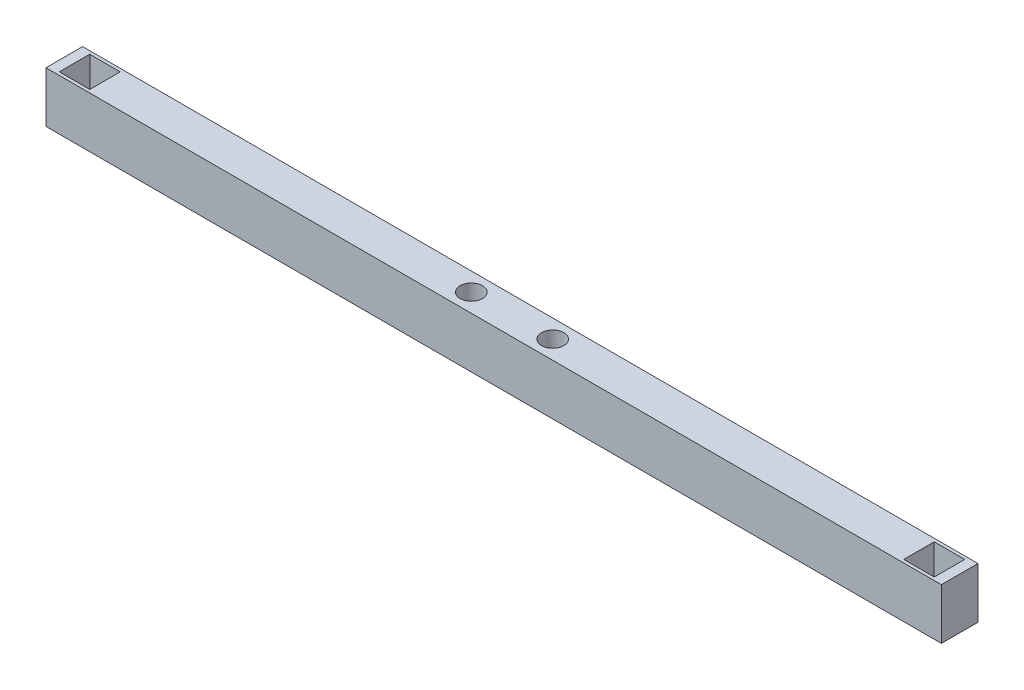
ISO-10303-21;
HEADER;
FILE_DESCRIPTION(('STEP AP214'),'2;1');
FILE_NAME('part.step','',(''),(''),'','','');
FILE_SCHEMA(('AUTOMOTIVE_DESIGN { 1 0 10303 214 1 1 1 1 }'));
ENDSEC;
DATA;
#1=APPLICATION_CONTEXT('core data for automotive mechanical design processes');
#2=APPLICATION_PROTOCOL_DEFINITION('international standard','automotive_design',2000,#1);
#3=PRODUCT_CONTEXT('',#1,'mechanical');
#4=PRODUCT('Part','Part','',(#3));
#5=PRODUCT_RELATED_PRODUCT_CATEGORY('part','',(#4));
#6=PRODUCT_DEFINITION_FORMATION('','',#4);
#7=PRODUCT_DEFINITION_CONTEXT('part definition',#1,'design');
#8=PRODUCT_DEFINITION('design','',#6,#7);
#9=PRODUCT_DEFINITION_SHAPE('','',#8);
#10=(LENGTH_UNIT() NAMED_UNIT(*) SI_UNIT(.MILLI.,.METRE.));
#11=(NAMED_UNIT(*) PLANE_ANGLE_UNIT() SI_UNIT($,.RADIAN.));
#12=(NAMED_UNIT(*) SI_UNIT($,.STERADIAN.) SOLID_ANGLE_UNIT());
#13=UNCERTAINTY_MEASURE_WITH_UNIT(LENGTH_MEASURE(1.E-05),#10,'distance_accuracy_value','');
#14=(GEOMETRIC_REPRESENTATION_CONTEXT(3) GLOBAL_UNCERTAINTY_ASSIGNED_CONTEXT((#13)) GLOBAL_UNIT_ASSIGNED_CONTEXT((#10,
#11,#12)) REPRESENTATION_CONTEXT('',''));
#15=CARTESIAN_POINT('',(0.,0.,0.));
#16=DIRECTION('',(0.,0.,1.));
#17=DIRECTION('',(1.,0.,0.));
#18=AXIS2_PLACEMENT_3D('',#15,#16,#17);
#19=CARTESIAN_POINT('',(0.,50.,0.));
#20=DIRECTION('',(0.,1.,0.));
#21=DIRECTION('',(0.,0.,1.));
#22=AXIS2_PLACEMENT_3D('',#19,#20,#21);
#23=PLANE('',#22);
#24=CARTESIAN_POINT('',(-40.,50.,0.));
#25=DIRECTION('',(0.,1.,0.));
#26=DIRECTION('',(0.,0.,1.));
#27=AXIS2_PLACEMENT_3D('',#24,#25,#26);
#28=CIRCLE('',#27,11.);
#29=CARTESIAN_POINT('',(-40.,50.,11.));
#30=VERTEX_POINT('',#29);
#31=EDGE_CURVE('E364',#30,#30,#28,.T.);
#32=ORIENTED_EDGE('',*,*,#31,.F.);
#33=EDGE_LOOP('',(#32));
#34=FACE_BOUND('',#33,.T.);
#35=CARTESIAN_POINT('',(40.,50.,0.));
#36=DIRECTION('',(0.,1.,0.));
#37=DIRECTION('',(0.,0.,1.));
#38=AXIS2_PLACEMENT_3D('',#35,#36,#37);
#39=CIRCLE('',#38,11.);
#40=CARTESIAN_POINT('',(40.,50.,11.));
#41=VERTEX_POINT('',#40);
#42=EDGE_CURVE('E160',#41,#41,#39,.T.);
#43=ORIENTED_EDGE('',*,*,#42,.F.);
#44=EDGE_LOOP('',(#43));
#45=FACE_BOUND('',#44,.T.);
#46=DIRECTION('',(1.,0.,0.));
#47=VECTOR('',#46,1.);
#48=CARTESIAN_POINT('',(400.,50.,15.));
#49=LINE('',#48,#47);
#50=CARTESIAN_POINT('',(400.,50.,15.));
#51=VERTEX_POINT('',#50);
#52=CARTESIAN_POINT('',(430.,50.,15.));
#53=VERTEX_POINT('',#52);
#54=EDGE_CURVE('E54',#51,#53,#49,.T.);
#55=ORIENTED_EDGE('',*,*,#54,.F.);
#56=DIRECTION('',(0.,0.,1.));
#57=VECTOR('',#56,1.);
#58=CARTESIAN_POINT('',(400.,50.,-15.));
#59=LINE('',#58,#57);
#60=CARTESIAN_POINT('',(400.,50.,-15.));
#61=VERTEX_POINT('',#60);
#62=EDGE_CURVE('E153',#61,#51,#59,.T.);
#63=ORIENTED_EDGE('',*,*,#62,.F.);
#64=DIRECTION('',(1.,0.,0.));
#65=VECTOR('',#64,1.);
#66=CARTESIAN_POINT('',(400.,50.,-15.));
#67=LINE('',#66,#65);
#68=CARTESIAN_POINT('',(430.,50.,-15.));
#69=VERTEX_POINT('',#68);
#70=EDGE_CURVE('E157',#61,#69,#67,.T.);
#71=ORIENTED_EDGE('',*,*,#70,.T.);
#72=DIRECTION('',(0.,0.,1.));
#73=VECTOR('',#72,1.);
#74=CARTESIAN_POINT('',(430.,50.,-15.));
#75=LINE('',#74,#73);
#76=EDGE_CURVE('E169',#69,#53,#75,.T.);
#77=ORIENTED_EDGE('',*,*,#76,.T.);
#78=EDGE_LOOP('',(#55,#63,#71,#77));
#79=FACE_BOUND('',#78,.T.);
#80=DIRECTION('',(0.,0.,-1.));
#81=VECTOR('',#80,1.);
#82=CARTESIAN_POINT('',(440.,50.,-18.));
#83=LINE('',#82,#81);
#84=CARTESIAN_POINT('',(440.,50.,18.));
#85=VERTEX_POINT('',#84);
#86=CARTESIAN_POINT('',(440.,50.,-18.));
#87=VERTEX_POINT('',#86);
#88=EDGE_CURVE('E225',#85,#87,#83,.T.);
#89=ORIENTED_EDGE('',*,*,#88,.T.);
#90=DIRECTION('',(-1.,0.,0.));
#91=VECTOR('',#90,1.);
#92=CARTESIAN_POINT('',(-440.,50.,-18.));
#93=LINE('',#92,#91);
#94=CARTESIAN_POINT('',(-440.,50.,-18.));
#95=VERTEX_POINT('',#94);
#96=EDGE_CURVE('E229',#87,#95,#93,.T.);
#97=ORIENTED_EDGE('',*,*,#96,.T.);
#98=DIRECTION('',(0.,0.,1.));
#99=VECTOR('',#98,1.);
#100=CARTESIAN_POINT('',(-440.,50.,-18.));
#101=LINE('',#100,#99);
#102=CARTESIAN_POINT('',(-440.,50.,18.));
#103=VERTEX_POINT('',#102);
#104=EDGE_CURVE('E233',#95,#103,#101,.T.);
#105=ORIENTED_EDGE('',*,*,#104,.T.);
#106=DIRECTION('',(1.,0.,0.));
#107=VECTOR('',#106,1.);
#108=CARTESIAN_POINT('',(-440.,50.,18.));
#109=LINE('',#108,#107);
#110=EDGE_CURVE('E236',#103,#85,#109,.T.);
#111=ORIENTED_EDGE('',*,*,#110,.T.);
#112=EDGE_LOOP('',(#89,#97,#105,#111));
#113=FACE_BOUND('',#112,.T.);
#114=DIRECTION('',(0.,0.,1.));
#115=VECTOR('',#114,1.);
#116=CARTESIAN_POINT('',(-400.,50.,-15.));
#117=LINE('',#116,#115);
#118=CARTESIAN_POINT('',(-400.,50.,-15.));
#119=VERTEX_POINT('',#118);
#120=CARTESIAN_POINT('',(-400.,50.,15.));
#121=VERTEX_POINT('',#120);
#122=EDGE_CURVE('E198',#119,#121,#117,.T.);
#123=ORIENTED_EDGE('',*,*,#122,.T.);
#124=DIRECTION('',(-1.,0.,0.));
#125=VECTOR('',#124,1.);
#126=CARTESIAN_POINT('',(-400.,50.,15.));
#127=LINE('',#126,#125);
#128=CARTESIAN_POINT('',(-430.,50.,15.));
#129=VERTEX_POINT('',#128);
#130=EDGE_CURVE('E62',#121,#129,#127,.T.);
#131=ORIENTED_EDGE('',*,*,#130,.T.);
#132=DIRECTION('',(0.,0.,1.));
#133=VECTOR('',#132,1.);
#134=CARTESIAN_POINT('',(-430.,50.,-15.));
#135=LINE('',#134,#133);
#136=CARTESIAN_POINT('',(-430.,50.,-15.));
#137=VERTEX_POINT('',#136);
#138=EDGE_CURVE('E207',#137,#129,#135,.T.);
#139=ORIENTED_EDGE('',*,*,#138,.F.);
#140=DIRECTION('',(-1.,0.,0.));
#141=VECTOR('',#140,1.);
#142=CARTESIAN_POINT('',(-400.,50.,-15.));
#143=LINE('',#142,#141);
#144=EDGE_CURVE('E202',#119,#137,#143,.T.);
#145=ORIENTED_EDGE('',*,*,#144,.F.);
#146=EDGE_LOOP('',(#123,#131,#139,#145));
#147=FACE_BOUND('',#146,.T.);
#148=ADVANCED_FACE('F38',(#34,#45,#79,#113,#147),#23,.T.);
#149=CARTESIAN_POINT('',(0.,0.,0.));
#150=DIRECTION('',(0.,1.,0.));
#151=DIRECTION('',(0.,0.,1.));
#152=AXIS2_PLACEMENT_3D('',#149,#150,#151);
#153=PLANE('',#152);
#154=CARTESIAN_POINT('',(-40.,0.,0.));
#155=DIRECTION('',(0.,1.,0.));
#156=DIRECTION('',(0.,0.,1.));
#157=AXIS2_PLACEMENT_3D('',#154,#155,#156);
#158=CIRCLE('',#157,11.);
#159=CARTESIAN_POINT('',(-40.,0.,11.));
#160=VERTEX_POINT('',#159);
#161=EDGE_CURVE('E188',#160,#160,#158,.T.);
#162=ORIENTED_EDGE('',*,*,#161,.T.);
#163=EDGE_LOOP('',(#162));
#164=FACE_BOUND('',#163,.T.);
#165=CARTESIAN_POINT('',(40.,0.,0.));
#166=DIRECTION('',(0.,1.,0.));
#167=DIRECTION('',(0.,0.,1.));
#168=AXIS2_PLACEMENT_3D('',#165,#166,#167);
#169=CIRCLE('',#168,11.);
#170=CARTESIAN_POINT('',(40.,0.,11.));
#171=VERTEX_POINT('',#170);
#172=EDGE_CURVE('E359',#171,#171,#169,.T.);
#173=ORIENTED_EDGE('',*,*,#172,.T.);
#174=EDGE_LOOP('',(#173));
#175=FACE_BOUND('',#174,.T.);
#176=DIRECTION('',(0.,0.,1.));
#177=VECTOR('',#176,1.);
#178=CARTESIAN_POINT('',(400.,0.,-15.));
#179=LINE('',#178,#177);
#180=CARTESIAN_POINT('',(400.,0.,-15.));
#181=VERTEX_POINT('',#180);
#182=CARTESIAN_POINT('',(400.,0.,15.));
#183=VERTEX_POINT('',#182);
#184=EDGE_CURVE('E147',#181,#183,#179,.T.);
#185=ORIENTED_EDGE('',*,*,#184,.T.);
#186=DIRECTION('',(1.,0.,0.));
#187=VECTOR('',#186,1.);
#188=CARTESIAN_POINT('',(400.,0.,15.));
#189=LINE('',#188,#187);
#190=CARTESIAN_POINT('',(430.,0.,15.));
#191=VERTEX_POINT('',#190);
#192=EDGE_CURVE('E141',#183,#191,#189,.T.);
#193=ORIENTED_EDGE('',*,*,#192,.T.);
#194=DIRECTION('',(0.,0.,1.));
#195=VECTOR('',#194,1.);
#196=CARTESIAN_POINT('',(430.,0.,-15.));
#197=LINE('',#196,#195);
#198=CARTESIAN_POINT('',(430.,0.,-15.));
#199=VERTEX_POINT('',#198);
#200=EDGE_CURVE('E129',#199,#191,#197,.T.);
#201=ORIENTED_EDGE('',*,*,#200,.F.);
#202=DIRECTION('',(1.,0.,0.));
#203=VECTOR('',#202,1.);
#204=CARTESIAN_POINT('',(400.,0.,-15.));
#205=LINE('',#204,#203);
#206=EDGE_CURVE('E140',#181,#199,#205,.T.);
#207=ORIENTED_EDGE('',*,*,#206,.F.);
#208=EDGE_LOOP('',(#185,#193,#201,#207));
#209=FACE_BOUND('',#208,.T.);
#210=DIRECTION('',(0.,0.,-1.));
#211=VECTOR('',#210,1.);
#212=CARTESIAN_POINT('',(440.,0.,-18.));
#213=LINE('',#212,#211);
#214=CARTESIAN_POINT('',(440.,0.,18.));
#215=VERTEX_POINT('',#214);
#216=CARTESIAN_POINT('',(440.,0.,-18.));
#217=VERTEX_POINT('',#216);
#218=EDGE_CURVE('E178',#215,#217,#213,.T.);
#219=ORIENTED_EDGE('',*,*,#218,.F.);
#220=DIRECTION('',(1.,0.,0.));
#221=VECTOR('',#220,1.);
#222=CARTESIAN_POINT('',(-440.,0.,18.));
#223=LINE('',#222,#221);
#224=CARTESIAN_POINT('',(-440.,0.,18.));
#225=VERTEX_POINT('',#224);
#226=EDGE_CURVE('E230',#225,#215,#223,.T.);
#227=ORIENTED_EDGE('',*,*,#226,.F.);
#228=DIRECTION('',(0.,0.,1.));
#229=VECTOR('',#228,1.);
#230=CARTESIAN_POINT('',(-440.,0.,-18.));
#231=LINE('',#230,#229);
#232=CARTESIAN_POINT('',(-440.,0.,-18.));
#233=VERTEX_POINT('',#232);
#234=EDGE_CURVE('E246',#233,#225,#231,.T.);
#235=ORIENTED_EDGE('',*,*,#234,.F.);
#236=DIRECTION('',(-1.,0.,0.));
#237=VECTOR('',#236,1.);
#238=CARTESIAN_POINT('',(-440.,0.,-18.));
#239=LINE('',#238,#237);
#240=EDGE_CURVE('E243',#217,#233,#239,.T.);
#241=ORIENTED_EDGE('',*,*,#240,.F.);
#242=EDGE_LOOP('',(#219,#227,#235,#241));
#243=FACE_BOUND('',#242,.T.);
#244=DIRECTION('',(-1.,0.,0.));
#245=VECTOR('',#244,1.);
#246=CARTESIAN_POINT('',(-400.,0.,15.));
#247=LINE('',#246,#245);
#248=CARTESIAN_POINT('',(-400.,0.,15.));
#249=VERTEX_POINT('',#248);
#250=CARTESIAN_POINT('',(-430.,0.,15.));
#251=VERTEX_POINT('',#250);
#252=EDGE_CURVE('E203',#249,#251,#247,.T.);
#253=ORIENTED_EDGE('',*,*,#252,.F.);
#254=DIRECTION('',(0.,0.,1.));
#255=VECTOR('',#254,1.);
#256=CARTESIAN_POINT('',(-400.,0.,-15.));
#257=LINE('',#256,#255);
#258=CARTESIAN_POINT('',(-400.,0.,-15.));
#259=VERTEX_POINT('',#258);
#260=EDGE_CURVE('E197',#259,#249,#257,.T.);
#261=ORIENTED_EDGE('',*,*,#260,.F.);
#262=DIRECTION('',(-1.,0.,0.));
#263=VECTOR('',#262,1.);
#264=CARTESIAN_POINT('',(-400.,0.,-15.));
#265=LINE('',#264,#263);
#266=CARTESIAN_POINT('',(-430.,0.,-15.));
#267=VERTEX_POINT('',#266);
#268=EDGE_CURVE('E215',#259,#267,#265,.T.);
#269=ORIENTED_EDGE('',*,*,#268,.T.);
#270=DIRECTION('',(0.,0.,1.));
#271=VECTOR('',#270,1.);
#272=CARTESIAN_POINT('',(-430.,0.,-15.));
#273=LINE('',#272,#271);
#274=EDGE_CURVE('E219',#267,#251,#273,.T.);
#275=ORIENTED_EDGE('',*,*,#274,.T.);
#276=EDGE_LOOP('',(#253,#261,#269,#275));
#277=FACE_BOUND('',#276,.T.);
#278=ADVANCED_FACE('F149',(#164,#175,#209,#243,#277),#153,.F.);
#279=CARTESIAN_POINT('',(440.,50.,-18.));
#280=DIRECTION('',(-1.,0.,0.));
#281=DIRECTION('',(0.,0.,1.));
#282=AXIS2_PLACEMENT_3D('',#279,#280,#281);
#283=PLANE('',#282);
#284=ORIENTED_EDGE('',*,*,#218,.T.);
#285=DIRECTION('',(0.,-1.,0.));
#286=VECTOR('',#285,1.);
#287=CARTESIAN_POINT('',(440.,50.,-18.));
#288=LINE('',#287,#286);
#289=EDGE_CURVE('E11',#87,#217,#288,.T.);
#290=ORIENTED_EDGE('',*,*,#289,.F.);
#291=ORIENTED_EDGE('',*,*,#88,.F.);
#292=DIRECTION('',(0.,-1.,0.));
#293=VECTOR('',#292,1.);
#294=CARTESIAN_POINT('',(440.,50.,18.));
#295=LINE('',#294,#293);
#296=EDGE_CURVE('E239',#85,#215,#295,.T.);
#297=ORIENTED_EDGE('',*,*,#296,.T.);
#298=EDGE_LOOP('',(#284,#290,#291,#297));
#299=FACE_BOUND('',#298,.T.);
#300=ADVANCED_FACE('F40',(#299),#283,.F.);
#301=CARTESIAN_POINT('',(-440.,50.,-18.));
#302=DIRECTION('',(0.,0.,1.));
#303=DIRECTION('',(1.,0.,0.));
#304=AXIS2_PLACEMENT_3D('',#301,#302,#303);
#305=PLANE('',#304);
#306=ORIENTED_EDGE('',*,*,#240,.T.);
#307=DIRECTION('',(0.,-1.,0.));
#308=VECTOR('',#307,1.);
#309=CARTESIAN_POINT('',(-440.,50.,-18.));
#310=LINE('',#309,#308);
#311=EDGE_CURVE('E47',#95,#233,#310,.T.);
#312=ORIENTED_EDGE('',*,*,#311,.F.);
#313=ORIENTED_EDGE('',*,*,#96,.F.);
#314=ORIENTED_EDGE('',*,*,#289,.T.);
#315=EDGE_LOOP('',(#306,#312,#313,#314));
#316=FACE_BOUND('',#315,.T.);
#317=ADVANCED_FACE('F278',(#316),#305,.F.);
#318=CARTESIAN_POINT('',(-440.,50.,-18.));
#319=DIRECTION('',(1.,0.,0.));
#320=DIRECTION('',(0.,0.,-1.));
#321=AXIS2_PLACEMENT_3D('',#318,#319,#320);
#322=PLANE('',#321);
#323=ORIENTED_EDGE('',*,*,#234,.T.);
#324=DIRECTION('',(0.,-1.,0.));
#325=VECTOR('',#324,1.);
#326=CARTESIAN_POINT('',(-440.,50.,18.));
#327=LINE('',#326,#325);
#328=EDGE_CURVE('E254',#103,#225,#327,.T.);
#329=ORIENTED_EDGE('',*,*,#328,.F.);
#330=ORIENTED_EDGE('',*,*,#104,.F.);
#331=ORIENTED_EDGE('',*,*,#311,.T.);
#332=EDGE_LOOP('',(#323,#329,#330,#331));
#333=FACE_BOUND('',#332,.T.);
#334=ADVANCED_FACE('F263',(#333),#322,.F.);
#335=CARTESIAN_POINT('',(-440.,50.,18.));
#336=DIRECTION('',(0.,0.,-1.));
#337=DIRECTION('',(-1.,0.,0.));
#338=AXIS2_PLACEMENT_3D('',#335,#336,#337);
#339=PLANE('',#338);
#340=ORIENTED_EDGE('',*,*,#226,.T.);
#341=ORIENTED_EDGE('',*,*,#296,.F.);
#342=ORIENTED_EDGE('',*,*,#110,.F.);
#343=ORIENTED_EDGE('',*,*,#328,.T.);
#344=EDGE_LOOP('',(#340,#341,#342,#343));
#345=FACE_BOUND('',#344,.T.);
#346=ADVANCED_FACE('F271',(#345),#339,.F.);
#347=CARTESIAN_POINT('',(-400.,0.,15.));
#348=DIRECTION('',(0.,0.,-1.));
#349=DIRECTION('',(-1.,0.,0.));
#350=AXIS2_PLACEMENT_3D('',#347,#348,#349);
#351=PLANE('',#350);
#352=ORIENTED_EDGE('',*,*,#130,.F.);
#353=DIRECTION('',(0.,1.,0.));
#354=VECTOR('',#353,1.);
#355=CARTESIAN_POINT('',(-400.,0.,15.));
#356=LINE('',#355,#354);
#357=EDGE_CURVE('E194',#249,#121,#356,.T.);
#358=ORIENTED_EDGE('',*,*,#357,.F.);
#359=ORIENTED_EDGE('',*,*,#252,.T.);
#360=DIRECTION('',(0.,1.,0.));
#361=VECTOR('',#360,1.);
#362=CARTESIAN_POINT('',(-430.,0.,15.));
#363=LINE('',#362,#361);
#364=EDGE_CURVE('E184',#251,#129,#363,.T.);
#365=ORIENTED_EDGE('',*,*,#364,.T.);
#366=EDGE_LOOP('',(#352,#358,#359,#365));
#367=FACE_BOUND('',#366,.T.);
#368=ADVANCED_FACE('F301',(#367),#351,.T.);
#369=CARTESIAN_POINT('',(-430.,0.,-15.));
#370=DIRECTION('',(-1.,0.,0.));
#371=DIRECTION('',(0.,0.,1.));
#372=AXIS2_PLACEMENT_3D('',#369,#370,#371);
#373=PLANE('',#372);
#374=ORIENTED_EDGE('',*,*,#138,.T.);
#375=ORIENTED_EDGE('',*,*,#364,.F.);
#376=ORIENTED_EDGE('',*,*,#274,.F.);
#377=DIRECTION('',(0.,1.,0.));
#378=VECTOR('',#377,1.);
#379=CARTESIAN_POINT('',(-430.,0.,-15.));
#380=LINE('',#379,#378);
#381=EDGE_CURVE('E187',#267,#137,#380,.T.);
#382=ORIENTED_EDGE('',*,*,#381,.T.);
#383=EDGE_LOOP('',(#374,#375,#376,#382));
#384=FACE_BOUND('',#383,.T.);
#385=ADVANCED_FACE('F305',(#384),#373,.F.);
#386=CARTESIAN_POINT('',(-400.,0.,-15.));
#387=DIRECTION('',(0.,0.,-1.));
#388=DIRECTION('',(-1.,0.,0.));
#389=AXIS2_PLACEMENT_3D('',#386,#387,#388);
#390=PLANE('',#389);
#391=ORIENTED_EDGE('',*,*,#144,.T.);
#392=ORIENTED_EDGE('',*,*,#381,.F.);
#393=ORIENTED_EDGE('',*,*,#268,.F.);
#394=DIRECTION('',(0.,1.,0.));
#395=VECTOR('',#394,1.);
#396=CARTESIAN_POINT('',(-400.,0.,-15.));
#397=LINE('',#396,#395);
#398=EDGE_CURVE('E191',#259,#119,#397,.T.);
#399=ORIENTED_EDGE('',*,*,#398,.T.);
#400=EDGE_LOOP('',(#391,#392,#393,#399));
#401=FACE_BOUND('',#400,.T.);
#402=ADVANCED_FACE('F310',(#401),#390,.F.);
#403=CARTESIAN_POINT('',(-400.,0.,-15.));
#404=DIRECTION('',(-1.,0.,0.));
#405=DIRECTION('',(0.,0.,1.));
#406=AXIS2_PLACEMENT_3D('',#403,#404,#405);
#407=PLANE('',#406);
#408=ORIENTED_EDGE('',*,*,#122,.F.);
#409=ORIENTED_EDGE('',*,*,#398,.F.);
#410=ORIENTED_EDGE('',*,*,#260,.T.);
#411=ORIENTED_EDGE('',*,*,#357,.T.);
#412=EDGE_LOOP('',(#408,#409,#410,#411));
#413=FACE_BOUND('',#412,.T.);
#414=ADVANCED_FACE('F297',(#413),#407,.T.);
#415=CARTESIAN_POINT('',(400.,0.,15.));
#416=DIRECTION('',(0.,0.,1.));
#417=DIRECTION('',(1.,0.,0.));
#418=AXIS2_PLACEMENT_3D('',#415,#416,#417);
#419=PLANE('',#418);
#420=ORIENTED_EDGE('',*,*,#54,.T.);
#421=DIRECTION('',(0.,1.,0.));
#422=VECTOR('',#421,1.);
#423=CARTESIAN_POINT('',(430.,0.,15.));
#424=LINE('',#423,#422);
#425=EDGE_CURVE('E132',#191,#53,#424,.T.);
#426=ORIENTED_EDGE('',*,*,#425,.F.);
#427=ORIENTED_EDGE('',*,*,#192,.F.);
#428=DIRECTION('',(0.,1.,0.));
#429=VECTOR('',#428,1.);
#430=CARTESIAN_POINT('',(400.,0.,15.));
#431=LINE('',#430,#429);
#432=EDGE_CURVE('E175',#183,#51,#431,.T.);
#433=ORIENTED_EDGE('',*,*,#432,.T.);
#434=EDGE_LOOP('',(#420,#426,#427,#433));
#435=FACE_BOUND('',#434,.T.);
#436=ADVANCED_FACE('F144',(#435),#419,.F.);
#437=CARTESIAN_POINT('',(400.,0.,-15.));
#438=DIRECTION('',(-1.,0.,0.));
#439=DIRECTION('',(0.,0.,1.));
#440=AXIS2_PLACEMENT_3D('',#437,#438,#439);
#441=PLANE('',#440);
#442=ORIENTED_EDGE('',*,*,#62,.T.);
#443=ORIENTED_EDGE('',*,*,#432,.F.);
#444=ORIENTED_EDGE('',*,*,#184,.F.);
#445=DIRECTION('',(0.,1.,0.));
#446=VECTOR('',#445,1.);
#447=CARTESIAN_POINT('',(400.,0.,-15.));
#448=LINE('',#447,#446);
#449=EDGE_CURVE('E179',#181,#61,#448,.T.);
#450=ORIENTED_EDGE('',*,*,#449,.T.);
#451=EDGE_LOOP('',(#442,#443,#444,#450));
#452=FACE_BOUND('',#451,.T.);
#453=ADVANCED_FACE('F332',(#452),#441,.F.);
#454=CARTESIAN_POINT('',(400.,0.,-15.));
#455=DIRECTION('',(0.,0.,1.));
#456=DIRECTION('',(1.,0.,0.));
#457=AXIS2_PLACEMENT_3D('',#454,#455,#456);
#458=PLANE('',#457);
#459=ORIENTED_EDGE('',*,*,#70,.F.);
#460=ORIENTED_EDGE('',*,*,#449,.F.);
#461=ORIENTED_EDGE('',*,*,#206,.T.);
#462=DIRECTION('',(0.,1.,0.));
#463=VECTOR('',#462,1.);
#464=CARTESIAN_POINT('',(430.,0.,-15.));
#465=LINE('',#464,#463);
#466=EDGE_CURVE('E134',#199,#69,#465,.T.);
#467=ORIENTED_EDGE('',*,*,#466,.T.);
#468=EDGE_LOOP('',(#459,#460,#461,#467));
#469=FACE_BOUND('',#468,.T.);
#470=ADVANCED_FACE('F336',(#469),#458,.T.);
#471=CARTESIAN_POINT('',(430.,0.,-15.));
#472=DIRECTION('',(-1.,0.,0.));
#473=DIRECTION('',(0.,0.,1.));
#474=AXIS2_PLACEMENT_3D('',#471,#472,#473);
#475=PLANE('',#474);
#476=ORIENTED_EDGE('',*,*,#76,.F.);
#477=ORIENTED_EDGE('',*,*,#466,.F.);
#478=ORIENTED_EDGE('',*,*,#200,.T.);
#479=ORIENTED_EDGE('',*,*,#425,.T.);
#480=EDGE_LOOP('',(#476,#477,#478,#479));
#481=FACE_BOUND('',#480,.T.);
#482=ADVANCED_FACE('F131',(#481),#475,.T.);
#483=CARTESIAN_POINT('',(40.,0.,0.));
#484=DIRECTION('',(0.,1.,0.));
#485=DIRECTION('',(0.,0.,1.));
#486=AXIS2_PLACEMENT_3D('',#483,#484,#485);
#487=CYLINDRICAL_SURFACE('',#486,11.);
#488=ORIENTED_EDGE('',*,*,#172,.F.);
#489=EDGE_LOOP('',(#488));
#490=FACE_BOUND('',#489,.T.);
#491=ORIENTED_EDGE('',*,*,#42,.T.);
#492=EDGE_LOOP('',(#491));
#493=FACE_BOUND('',#492,.T.);
#494=ADVANCED_FACE('F345',(#490,#493),#487,.F.);
#495=CARTESIAN_POINT('',(-40.,0.,0.));
#496=DIRECTION('',(0.,1.,0.));
#497=DIRECTION('',(0.,0.,1.));
#498=AXIS2_PLACEMENT_3D('',#495,#496,#497);
#499=CYLINDRICAL_SURFACE('',#498,11.);
#500=ORIENTED_EDGE('',*,*,#161,.F.);
#501=EDGE_LOOP('',(#500));
#502=FACE_BOUND('',#501,.T.);
#503=ORIENTED_EDGE('',*,*,#31,.T.);
#504=EDGE_LOOP('',(#503));
#505=FACE_BOUND('',#504,.T.);
#506=ADVANCED_FACE('F350',(#502,#505),#499,.F.);
#507=CLOSED_SHELL('',(#148,#278,#300,#317,#334,#346,#368,#385,#402,#414,#436,#453,#470,#482,
#494,#506));
#508=MANIFOLD_SOLID_BREP('B2',#507);
#509=ADVANCED_BREP_SHAPE_REPRESENTATION('',(#18,#508),#14);
#510=SHAPE_DEFINITION_REPRESENTATION(#9,#509);
ENDSEC;
END-ISO-10303-21;
